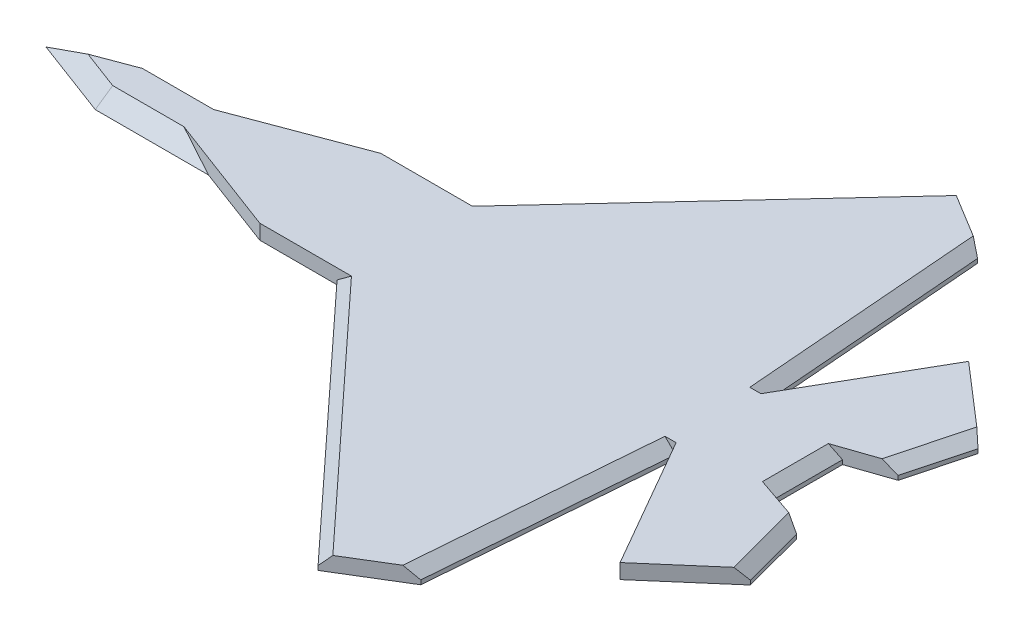
ISO-10303-21;
HEADER;
FILE_DESCRIPTION(('STEP AP214'),'2;1');
FILE_NAME('part.step','',(''),(''),'','','');
FILE_SCHEMA(('AUTOMOTIVE_DESIGN { 1 0 10303 214 1 1 1 1 }'));
ENDSEC;
DATA;
#1=APPLICATION_CONTEXT('core data for automotive mechanical design processes');
#2=APPLICATION_PROTOCOL_DEFINITION('international standard','automotive_design',2000,#1);
#3=PRODUCT_CONTEXT('',#1,'mechanical');
#4=PRODUCT('Part','Part','',(#3));
#5=PRODUCT_RELATED_PRODUCT_CATEGORY('part','',(#4));
#6=PRODUCT_DEFINITION_FORMATION('','',#4);
#7=PRODUCT_DEFINITION_CONTEXT('part definition',#1,'design');
#8=PRODUCT_DEFINITION('design','',#6,#7);
#9=PRODUCT_DEFINITION_SHAPE('','',#8);
#10=(LENGTH_UNIT() NAMED_UNIT(*) SI_UNIT(.MILLI.,.METRE.));
#11=(NAMED_UNIT(*) PLANE_ANGLE_UNIT() SI_UNIT($,.RADIAN.));
#12=(NAMED_UNIT(*) SI_UNIT($,.STERADIAN.) SOLID_ANGLE_UNIT());
#13=UNCERTAINTY_MEASURE_WITH_UNIT(LENGTH_MEASURE(1.E-05),#10,'distance_accuracy_value','');
#14=(GEOMETRIC_REPRESENTATION_CONTEXT(3) GLOBAL_UNCERTAINTY_ASSIGNED_CONTEXT((#13)) GLOBAL_UNIT_ASSIGNED_CONTEXT((#10,
#11,#12)) REPRESENTATION_CONTEXT('',''));
#15=CARTESIAN_POINT('',(0.,0.,0.));
#16=DIRECTION('',(0.,0.,1.));
#17=DIRECTION('',(1.,0.,0.));
#18=AXIS2_PLACEMENT_3D('',#15,#16,#17);
#19=CARTESIAN_POINT('',(11.0410396775364,0.7,1.65535448667242));
#20=DIRECTION('',(0.351548913957033,0.,-0.936169515149703));
#21=DIRECTION('',(-0.936169515149703,0.,-0.351548913957033));
#22=AXIS2_PLACEMENT_3D('',#19,#20,#21);
#23=PLANE('',#22);
#24=DIRECTION('',(0.936169515149703,0.,0.351548913957033));
#25=VECTOR('',#24,1.);
#26=CARTESIAN_POINT('',(11.0410396775364,0.,1.65535448667242));
#27=LINE('',#26,#25);
#28=CARTESIAN_POINT('',(10.2421441514952,0.,1.35535448667241));
#29=VERTEX_POINT('',#28);
#30=CARTESIAN_POINT('',(14.1370887976962,0.,2.81797801599737));
#31=VERTEX_POINT('',#30);
#32=EDGE_CURVE('E267',#29,#31,#27,.T.);
#33=ORIENTED_EDGE('',*,*,#32,.T.);
#34=DIRECTION('',(0.,-1.,0.));
#35=VECTOR('',#34,1.);
#36=CARTESIAN_POINT('',(14.1370887976962,0.7,2.81797801599737));
#37=LINE('',#36,#35);
#38=CARTESIAN_POINT('',(14.1370887976962,0.7,2.81797801599737));
#39=VERTEX_POINT('',#38);
#40=EDGE_CURVE('E266',#39,#31,#37,.T.);
#41=ORIENTED_EDGE('',*,*,#40,.F.);
#42=DIRECTION('',(0.936169515149703,0.,0.351548913957033));
#43=VECTOR('',#42,1.);
#44=CARTESIAN_POINT('',(11.0410396775364,0.7,1.65535448667242));
#45=LINE('',#44,#43);
#46=CARTESIAN_POINT('',(8.37805459073245,0.7,0.655354486672405));
#47=VERTEX_POINT('',#46);
#48=EDGE_CURVE('E250',#47,#39,#45,.T.);
#49=ORIENTED_EDGE('',*,*,#48,.F.);
#50=DIRECTION('',(-0.883184039008036,0.331651890723881,-0.331651890723884));
#51=VECTOR('',#50,1.);
#52=CARTESIAN_POINT('',(10.7481300211423,-0.190007023379282,1.5453615100517));
#53=LINE('',#52,#51);
#54=EDGE_CURVE('E422',#47,#29,#53,.F.);
#55=ORIENTED_EDGE('',*,*,#54,.T.);
#56=EDGE_LOOP('',(#33,#41,#49,#55));
#57=FACE_BOUND('',#56,.T.);
#58=ADVANCED_FACE('F42',(#57),#23,.F.);
#59=CARTESIAN_POINT('',(14.1370887976962,0.7,2.81797801599737));
#60=DIRECTION('',(0.,0.,-1.));
#61=DIRECTION('',(-1.,0.,0.));
#62=AXIS2_PLACEMENT_3D('',#59,#60,#61);
#63=PLANE('',#62);
#64=DIRECTION('',(1.,0.,0.));
#65=VECTOR('',#64,1.);
#66=CARTESIAN_POINT('',(14.1370887976962,0.,2.81797801599737));
#67=LINE('',#66,#65);
#68=CARTESIAN_POINT('',(17.7986590133896,0.,2.81797801599737));
#69=VERTEX_POINT('',#68);
#70=EDGE_CURVE('E309',#31,#69,#67,.T.);
#71=ORIENTED_EDGE('',*,*,#70,.T.);
#72=DIRECTION('',(0.,-1.,0.));
#73=VECTOR('',#72,1.);
#74=CARTESIAN_POINT('',(17.7986590133896,0.7,2.81797801599737));
#75=LINE('',#74,#73);
#76=CARTESIAN_POINT('',(17.7986590133896,0.199999999999999,2.81797801599737));
#77=VERTEX_POINT('',#76);
#78=EDGE_CURVE('E272',#77,#69,#75,.T.);
#79=ORIENTED_EDGE('',*,*,#78,.F.);
#80=DIRECTION('',(-0.806261036985968,-0.591559921088567,0.));
#81=VECTOR('',#80,1.);
#82=CARTESIAN_POINT('',(15.6569060348871,-1.37142062537271,2.81797801599737));
#83=LINE('',#82,#81);
#84=CARTESIAN_POINT('',(18.4801293160956,0.7,2.81797801599737));
#85=VERTEX_POINT('',#84);
#86=EDGE_CURVE('E51',#77,#85,#83,.F.);
#87=ORIENTED_EDGE('',*,*,#86,.T.);
#88=DIRECTION('',(1.,0.,0.));
#89=VECTOR('',#88,1.);
#90=CARTESIAN_POINT('',(14.1370887976962,0.7,2.81797801599737));
#91=LINE('',#90,#89);
#92=EDGE_CURVE('E256',#39,#85,#91,.T.);
#93=ORIENTED_EDGE('',*,*,#92,.F.);
#94=ORIENTED_EDGE('',*,*,#40,.T.);
#95=EDGE_LOOP('',(#71,#79,#87,#93,#94));
#96=FACE_BOUND('',#95,.T.);
#97=ADVANCED_FACE('F274',(#96),#63,.F.);
#98=CARTESIAN_POINT('',(17.7986590133896,0.7,2.81797801599737));
#99=DIRECTION('',(0.733707687649136,0.,-0.679465252301071));
#100=DIRECTION('',(-0.679465252301071,0.,-0.733707687649136));
#101=AXIS2_PLACEMENT_3D('',#98,#99,#100);
#102=PLANE('',#101);
#103=DIRECTION('',(0.,-1.,0.));
#104=VECTOR('',#103,1.);
#105=CARTESIAN_POINT('',(29.0707661861376,0.7,14.9899495195314));
#106=LINE('',#105,#104);
#107=CARTESIAN_POINT('',(29.0707661861376,0.199999999999999,14.9899495195314));
#108=VERTEX_POINT('',#107);
#109=CARTESIAN_POINT('',(29.0707661861376,0.,14.9899495195314));
#110=VERTEX_POINT('',#109);
#111=EDGE_CURVE('E400',#108,#110,#106,.T.);
#112=ORIENTED_EDGE('',*,*,#111,.F.);
#113=DIRECTION('',(-0.679465252301071,0.,-0.733707687649136));
#114=VECTOR('',#113,1.);
#115=CARTESIAN_POINT('',(17.7986590133896,0.199999999999999,2.81797801599737));
#116=LINE('',#115,#114);
#117=EDGE_CURVE('E64',#108,#77,#116,.T.);
#118=ORIENTED_EDGE('',*,*,#117,.T.);
#119=ORIENTED_EDGE('',*,*,#78,.T.);
#120=DIRECTION('',(0.679465252301071,0.,0.733707687649136));
#121=VECTOR('',#120,1.);
#122=CARTESIAN_POINT('',(17.7986590133896,0.,2.81797801599737));
#123=LINE('',#122,#121);
#124=EDGE_CURVE('E312',#69,#110,#123,.T.);
#125=ORIENTED_EDGE('',*,*,#124,.T.);
#126=EDGE_LOOP('',(#112,#118,#119,#125));
#127=FACE_BOUND('',#126,.T.);
#128=ADVANCED_FACE('F631',(#127),#102,.F.);
#129=CARTESIAN_POINT('',(29.0707661861376,0.7,14.9899495195314));
#130=DIRECTION('',(-0.520566767919859,0.,-0.853820964920323));
#131=DIRECTION('',(-0.853820964920323,0.,0.520566767919859));
#132=AXIS2_PLACEMENT_3D('',#129,#130,#131);
#133=PLANE('',#132);
#134=DIRECTION('',(0.853820964920323,0.,-0.520566767919859));
#135=VECTOR('',#134,1.);
#136=CARTESIAN_POINT('',(29.0707661861376,0.7,14.9899495195314));
#137=LINE('',#136,#135);
#138=CARTESIAN_POINT('',(29.5063171121257,0.7,14.7243981368392));
#139=VERTEX_POINT('',#138);
#140=CARTESIAN_POINT('',(31.5669709440536,0.7,13.4680364999608));
#141=VERTEX_POINT('',#140);
#142=EDGE_CURVE('E277',#139,#141,#137,.T.);
#143=ORIENTED_EDGE('',*,*,#142,.F.);
#144=DIRECTION('',(0.609760501852625,0.699987608187588,-0.371765354443169));
#145=VECTOR('',#144,1.);
#146=CARTESIAN_POINT('',(26.8435518005458,-2.35677838422562,16.3478615898684));
#147=LINE('',#146,#145);
#148=EDGE_CURVE('E474',#139,#108,#147,.F.);
#149=ORIENTED_EDGE('',*,*,#148,.T.);
#150=ORIENTED_EDGE('',*,*,#111,.T.);
#151=DIRECTION('',(0.853820964920323,0.,-0.520566767919859));
#152=VECTOR('',#151,1.);
#153=CARTESIAN_POINT('',(29.0707661861376,0.,14.9899495195314));
#154=LINE('',#153,#152);
#155=CARTESIAN_POINT('',(32.0942080010503,0.,13.1465849287711));
#156=VERTEX_POINT('',#155);
#157=EDGE_CURVE('E315',#110,#156,#154,.T.);
#158=ORIENTED_EDGE('',*,*,#157,.T.);
#159=DIRECTION('',(0.,-1.,0.));
#160=VECTOR('',#159,1.);
#161=CARTESIAN_POINT('',(32.0942080010503,0.7,13.1465849287711));
#162=LINE('',#161,#160);
#163=CARTESIAN_POINT('',(32.0942080010503,0.199999999999999,13.1465849287711));
#164=VERTEX_POINT('',#163);
#165=EDGE_CURVE('E398',#164,#156,#162,.T.);
#166=ORIENTED_EDGE('',*,*,#165,.F.);
#167=DIRECTION('',(0.663566700068654,-0.62928685613312,-0.404570497266041));
#168=VECTOR('',#167,1.);
#169=CARTESIAN_POINT('',(34.8700813751098,-2.43247180487636,11.4541605331909));
#170=LINE('',#169,#168);
#171=EDGE_CURVE('E472',#164,#141,#170,.F.);
#172=ORIENTED_EDGE('',*,*,#171,.T.);
#173=EDGE_LOOP('',(#143,#149,#150,#158,#166,#172));
#174=FACE_BOUND('',#173,.T.);
#175=ADVANCED_FACE('F551',(#174),#133,.F.);
#176=CARTESIAN_POINT('',(32.0942080010503,0.7,13.1465849287711));
#177=DIRECTION('',(-0.996832039263626,0.,-0.0795354354833161));
#178=DIRECTION('',(-0.0795354354833161,0.,0.996832039263626));
#179=AXIS2_PLACEMENT_3D('',#176,#177,#178);
#180=PLANE('',#179);
#181=DIRECTION('',(0.,-1.,0.));
#182=VECTOR('',#181,1.);
#183=CARTESIAN_POINT('',(32.9866731254356,0.7,1.96115764712529));
#184=LINE('',#183,#182);
#185=CARTESIAN_POINT('',(32.9866731254356,0.199999999999999,1.96115764712529));
#186=VERTEX_POINT('',#185);
#187=CARTESIAN_POINT('',(32.9866731254356,0.,1.96115764712529));
#188=VERTEX_POINT('',#187);
#189=EDGE_CURVE('E396',#186,#188,#184,.T.);
#190=ORIENTED_EDGE('',*,*,#189,.F.);
#191=DIRECTION('',(-0.0795354354833161,0.,0.996832039263626));
#192=VECTOR('',#191,1.);
#193=CARTESIAN_POINT('',(32.0942080010503,0.199999999999999,13.1465849287711));
#194=LINE('',#193,#192);
#195=EDGE_CURVE('E477',#186,#164,#194,.T.);
#196=ORIENTED_EDGE('',*,*,#195,.T.);
#197=ORIENTED_EDGE('',*,*,#165,.T.);
#198=DIRECTION('',(0.0795354354833161,0.,-0.996832039263626));
#199=VECTOR('',#198,1.);
#200=CARTESIAN_POINT('',(32.0942080010503,0.,13.1465849287711));
#201=LINE('',#200,#199);
#202=EDGE_CURVE('E318',#156,#188,#201,.T.);
#203=ORIENTED_EDGE('',*,*,#202,.T.);
#204=EDGE_LOOP('',(#190,#196,#197,#203));
#205=FACE_BOUND('',#204,.T.);
#206=ADVANCED_FACE('F834',(#205),#180,.F.);
#207=CARTESIAN_POINT('',(32.9866731254356,0.7,1.96115764712529));
#208=DIRECTION('',(0.,0.,-1.));
#209=DIRECTION('',(-1.,0.,0.));
#210=AXIS2_PLACEMENT_3D('',#207,#208,#209);
#211=PLANE('',#210);
#212=DIRECTION('',(1.,0.,0.));
#213=VECTOR('',#212,1.);
#214=CARTESIAN_POINT('',(32.9866731254356,0.,1.96115764712529));
#215=LINE('',#214,#213);
#216=CARTESIAN_POINT('',(33.011493829214,0.,1.96115764712529));
#217=VERTEX_POINT('',#216);
#218=EDGE_CURVE('E321',#188,#217,#215,.T.);
#219=ORIENTED_EDGE('',*,*,#218,.T.);
#220=DIRECTION('',(0.,-1.,0.));
#221=VECTOR('',#220,1.);
#222=CARTESIAN_POINT('',(33.011493829214,0.7,1.96115764712529));
#223=LINE('',#222,#221);
#224=CARTESIAN_POINT('',(33.011493829214,0.7,1.96115764712529));
#225=VERTEX_POINT('',#224);
#226=EDGE_CURVE('E393',#225,#217,#223,.T.);
#227=ORIENTED_EDGE('',*,*,#226,.F.);
#228=DIRECTION('',(1.,0.,0.));
#229=VECTOR('',#228,1.);
#230=CARTESIAN_POINT('',(32.9866731254356,0.7,1.96115764712529));
#231=LINE('',#230,#229);
#232=CARTESIAN_POINT('',(32.4850841111325,0.7,1.96115764712529));
#233=VERTEX_POINT('',#232);
#234=EDGE_CURVE('E280',#233,#225,#231,.T.);
#235=ORIENTED_EDGE('',*,*,#234,.F.);
#236=DIRECTION('',(-0.708227710097085,0.70598407251909,0.));
#237=VECTOR('',#236,1.);
#238=CARTESIAN_POINT('',(32.736674383913,0.44920675532532,1.96115764712529));
#239=LINE('',#238,#237);
#240=EDGE_CURVE('E11',#233,#186,#239,.F.);
#241=ORIENTED_EDGE('',*,*,#240,.T.);
#242=ORIENTED_EDGE('',*,*,#189,.T.);
#243=EDGE_LOOP('',(#219,#227,#235,#241,#242));
#244=FACE_BOUND('',#243,.T.);
#245=ADVANCED_FACE('F559',(#244),#211,.F.);
#246=CARTESIAN_POINT('',(33.011493829214,0.7,1.96115764712529));
#247=DIRECTION('',(0.866853810966156,0.,-0.498562403730417));
#248=DIRECTION('',(-0.498562403730417,0.,-0.866853810966156));
#249=AXIS2_PLACEMENT_3D('',#246,#247,#248);
#250=PLANE('',#249);
#251=DIRECTION('',(0.498562403730417,0.,0.866853810966157));
#252=VECTOR('',#251,1.);
#253=CARTESIAN_POINT('',(33.011493829214,0.,1.96115764712529));
#254=LINE('',#253,#252);
#255=CARTESIAN_POINT('',(36.6051406744816,0.,8.20945563305031));
#256=VERTEX_POINT('',#255);
#257=EDGE_CURVE('E323',#217,#256,#254,.T.);
#258=ORIENTED_EDGE('',*,*,#257,.T.);
#259=DIRECTION('',(0.,-1.,0.));
#260=VECTOR('',#259,1.);
#261=CARTESIAN_POINT('',(36.6051406744816,0.7,8.20945563305031));
#262=LINE('',#261,#260);
#263=CARTESIAN_POINT('',(36.6051406744816,0.7,8.20945563305031));
#264=VERTEX_POINT('',#263);
#265=EDGE_CURVE('E390',#264,#256,#262,.T.);
#266=ORIENTED_EDGE('',*,*,#265,.F.);
#267=DIRECTION('',(0.498562403730417,0.,0.866853810966157));
#268=VECTOR('',#267,1.);
#269=CARTESIAN_POINT('',(33.011493829214,0.7,1.96115764712529));
#270=LINE('',#269,#268);
#271=EDGE_CURVE('E284',#225,#264,#270,.T.);
#272=ORIENTED_EDGE('',*,*,#271,.F.);
#273=ORIENTED_EDGE('',*,*,#226,.T.);
#274=EDGE_LOOP('',(#258,#266,#272,#273));
#275=FACE_BOUND('',#274,.T.);
#276=ADVANCED_FACE('F563',(#275),#250,.F.);
#277=CARTESIAN_POINT('',(36.6051406744816,0.7,8.20945563305031));
#278=DIRECTION('',(-0.654307622119322,0.,-0.75622849432996));
#279=DIRECTION('',(-0.75622849432996,0.,0.654307622119322));
#280=AXIS2_PLACEMENT_3D('',#277,#278,#279);
#281=PLANE('',#280);
#282=DIRECTION('',(0.,-1.,0.));
#283=VECTOR('',#282,1.);
#284=CARTESIAN_POINT('',(39.9164502704821,0.7,5.34442856239009));
#285=LINE('',#284,#283);
#286=CARTESIAN_POINT('',(39.9164502704821,0.2,5.34442856239009));
#287=VERTEX_POINT('',#286);
#288=CARTESIAN_POINT('',(39.9164502704821,0.,5.34442856239009));
#289=VERTEX_POINT('',#288);
#290=EDGE_CURVE('E388',#287,#289,#285,.T.);
#291=ORIENTED_EDGE('',*,*,#290,.F.);
#292=DIRECTION('',(0.562224307068311,-0.668782357841126,-0.486450394574845));
#293=VECTOR('',#292,1.);
#294=CARTESIAN_POINT('',(42.3653303273192,-2.71301489083901,3.22559688802398));
#295=LINE('',#294,#293);
#296=CARTESIAN_POINT('',(39.4961159864833,0.7,5.70811219494369));
#297=VERTEX_POINT('',#296);
#298=EDGE_CURVE('E456',#287,#297,#295,.F.);
#299=ORIENTED_EDGE('',*,*,#298,.T.);
#300=DIRECTION('',(0.75622849432996,0.,-0.654307622119322));
#301=VECTOR('',#300,1.);
#302=CARTESIAN_POINT('',(36.6051406744816,0.7,8.20945563305031));
#303=LINE('',#302,#301);
#304=EDGE_CURVE('E286',#264,#297,#303,.T.);
#305=ORIENTED_EDGE('',*,*,#304,.F.);
#306=ORIENTED_EDGE('',*,*,#265,.T.);
#307=DIRECTION('',(0.75622849432996,0.,-0.654307622119322));
#308=VECTOR('',#307,1.);
#309=CARTESIAN_POINT('',(36.6051406744816,0.,8.20945563305031));
#310=LINE('',#309,#308);
#311=EDGE_CURVE('E325',#256,#289,#310,.T.);
#312=ORIENTED_EDGE('',*,*,#311,.T.);
#313=EDGE_LOOP('',(#291,#299,#305,#306,#312));
#314=FACE_BOUND('',#313,.T.);
#315=ADVANCED_FACE('F568',(#314),#281,.F.);
#316=CARTESIAN_POINT('',(39.9164502704821,0.7,5.34442856239009));
#317=DIRECTION('',(-0.966074987931891,0.,0.258261723242909));
#318=DIRECTION('',(0.258261723242909,0.,0.966074987931891));
#319=AXIS2_PLACEMENT_3D('',#316,#317,#318);
#320=PLANE('',#319);
#321=DIRECTION('',(0.,-1.,0.));
#322=VECTOR('',#321,1.);
#323=CARTESIAN_POINT('',(39.1176402500264,0.7,2.35633427113597));
#324=LINE('',#323,#322);
#325=CARTESIAN_POINT('',(39.1176402500264,0.2,2.35633427113597));
#326=VERTEX_POINT('',#325);
#327=CARTESIAN_POINT('',(39.1176402500264,0.,2.35633427113597));
#328=VERTEX_POINT('',#327);
#329=EDGE_CURVE('E386',#326,#328,#324,.T.);
#330=ORIENTED_EDGE('',*,*,#329,.F.);
#331=DIRECTION('',(0.258261723242909,0.,0.966074987931891));
#332=VECTOR('',#331,1.);
#333=CARTESIAN_POINT('',(39.9164502704821,0.2,5.34442856239009));
#334=LINE('',#333,#332);
#335=EDGE_CURVE('E454',#326,#287,#334,.T.);
#336=ORIENTED_EDGE('',*,*,#335,.T.);
#337=ORIENTED_EDGE('',*,*,#290,.T.);
#338=DIRECTION('',(-0.258261723242909,0.,-0.966074987931891));
#339=VECTOR('',#338,1.);
#340=CARTESIAN_POINT('',(39.9164502704821,0.,5.34442856239009));
#341=LINE('',#340,#339);
#342=EDGE_CURVE('E328',#289,#328,#341,.T.);
#343=ORIENTED_EDGE('',*,*,#342,.T.);
#344=EDGE_LOOP('',(#330,#336,#337,#343));
#345=FACE_BOUND('',#344,.T.);
#346=ADVANCED_FACE('F579',(#345),#320,.F.);
#347=CARTESIAN_POINT('',(39.1176402500264,0.7,2.35633427113597));
#348=DIRECTION('',(-0.324142953889491,0.,0.946008110664912));
#349=DIRECTION('',(0.946008110664912,0.,0.324142953889491));
#350=AXIS2_PLACEMENT_3D('',#347,#348,#349);
#351=PLANE('',#350);
#352=DIRECTION('',(-0.946008110664912,0.,-0.324142953889491));
#353=VECTOR('',#352,1.);
#354=CARTESIAN_POINT('',(39.1176402500264,0.7,2.35633427113597));
#355=LINE('',#354,#353);
#356=CARTESIAN_POINT('',(38.547893859349,0.7,2.16111472073249));
#357=VERTEX_POINT('',#356);
#358=CARTESIAN_POINT('',(36.6558593795197,0.7,1.51282255680846));
#359=VERTEX_POINT('',#358);
#360=EDGE_CURVE('E289',#357,#359,#355,.T.);
#361=ORIENTED_EDGE('',*,*,#360,.F.);
#362=DIRECTION('',(-0.727863563472156,0.638761013129685,-0.249397275596896));
#363=VECTOR('',#362,1.);
#364=CARTESIAN_POINT('',(34.7880873914164,3.99954391063574,0.872843763190797));
#365=LINE('',#364,#363);
#366=EDGE_CURVE('E452',#357,#326,#365,.F.);
#367=ORIENTED_EDGE('',*,*,#366,.T.);
#368=ORIENTED_EDGE('',*,*,#329,.T.);
#369=DIRECTION('',(-0.946008110664912,0.,-0.324142953889491));
#370=VECTOR('',#369,1.);
#371=CARTESIAN_POINT('',(39.1176402500264,0.,2.35633427113597));
#372=LINE('',#371,#370);
#373=CARTESIAN_POINT('',(37.1558593795197,0.,1.68414400227771));
#374=VERTEX_POINT('',#373);
#375=EDGE_CURVE('E331',#328,#374,#372,.T.);
#376=ORIENTED_EDGE('',*,*,#375,.T.);
#377=DIRECTION('',(0.,-1.,0.));
#378=VECTOR('',#377,1.);
#379=CARTESIAN_POINT('',(37.1558593795197,0.7,1.68414400227771));
#380=LINE('',#379,#378);
#381=CARTESIAN_POINT('',(37.1558593795197,0.200000000000006,1.68414400227771));
#382=VERTEX_POINT('',#381);
#383=EDGE_CURVE('E384',#382,#374,#380,.T.);
#384=ORIENTED_EDGE('',*,*,#383,.F.);
#385=DIRECTION('',(0.687223686615927,-0.687223686615917,0.235472310703493));
#386=VECTOR('',#385,1.);
#387=CARTESIAN_POINT('',(37.9549992541256,-0.599139874605936,1.95796359917692));
#388=LINE('',#387,#386);
#389=EDGE_CURVE('E481',#382,#359,#388,.F.);
#390=ORIENTED_EDGE('',*,*,#389,.T.);
#391=EDGE_LOOP('',(#361,#367,#368,#376,#384,#390));
#392=FACE_BOUND('',#391,.T.);
#393=ADVANCED_FACE('F577',(#392),#351,.F.);
#394=CARTESIAN_POINT('',(37.1558593795197,0.7,-1.78164049469839));
#395=DIRECTION('',(-1.,0.,0.));
#396=DIRECTION('',(0.,0.,1.));
#397=AXIS2_PLACEMENT_3D('',#394,#395,#396);
#398=PLANE('',#397);
#399=DIRECTION('',(0.,-1.,0.));
#400=VECTOR('',#399,1.);
#401=CARTESIAN_POINT('',(37.1558593795197,0.7,-1.78164049469839));
#402=LINE('',#401,#400);
#403=CARTESIAN_POINT('',(37.1558593795197,0.200000000000006,-1.78164049469839));
#404=VERTEX_POINT('',#403);
#405=CARTESIAN_POINT('',(37.1558593795197,0.,-1.78164049469839));
#406=VERTEX_POINT('',#405);
#407=EDGE_CURVE('E382',#404,#406,#402,.T.);
#408=ORIENTED_EDGE('',*,*,#407,.F.);
#409=DIRECTION('',(0.,0.,1.));
#410=VECTOR('',#409,1.);
#411=CARTESIAN_POINT('',(37.1558593795197,0.200000000000006,-1.78164049469839));
#412=LINE('',#411,#410);
#413=EDGE_CURVE('E450',#404,#382,#412,.T.);
#414=ORIENTED_EDGE('',*,*,#413,.T.);
#415=ORIENTED_EDGE('',*,*,#383,.T.);
#416=DIRECTION('',(0.,0.,-1.));
#417=VECTOR('',#416,1.);
#418=CARTESIAN_POINT('',(37.1558593795197,0.,-1.78164049469839));
#419=LINE('',#418,#417);
#420=EDGE_CURVE('E334',#374,#406,#419,.T.);
#421=ORIENTED_EDGE('',*,*,#420,.T.);
#422=EDGE_LOOP('',(#408,#414,#415,#421));
#423=FACE_BOUND('',#422,.T.);
#424=ADVANCED_FACE('F788',(#423),#398,.F.);
#425=CARTESIAN_POINT('',(39.1176402500264,0.7,-2.45383076355665));
#426=DIRECTION('',(-0.324142953889491,0.,-0.946008110664912));
#427=DIRECTION('',(-0.946008110664912,0.,0.324142953889491));
#428=AXIS2_PLACEMENT_3D('',#425,#426,#427);
#429=PLANE('',#428);
#430=DIRECTION('',(0.,-1.,0.));
#431=VECTOR('',#430,1.);
#432=CARTESIAN_POINT('',(39.1176402500264,0.7,-2.45383076355665));
#433=LINE('',#432,#431);
#434=CARTESIAN_POINT('',(39.1176402500264,0.199999999999999,-2.45383076355665));
#435=VERTEX_POINT('',#434);
#436=CARTESIAN_POINT('',(39.1176402500264,0.,-2.45383076355665));
#437=VERTEX_POINT('',#436);
#438=EDGE_CURVE('E380',#435,#437,#433,.T.);
#439=ORIENTED_EDGE('',*,*,#438,.F.);
#440=DIRECTION('',(0.727863563472155,-0.638761013129686,-0.249397275596895));
#441=VECTOR('',#440,1.);
#442=CARTESIAN_POINT('',(34.7586823482283,4.02534928972131,-0.960264826605333));
#443=LINE('',#442,#441);
#444=CARTESIAN_POINT('',(38.547893859349,0.7,-2.25861121315318));
#445=VERTEX_POINT('',#444);
#446=EDGE_CURVE('E462',#435,#445,#443,.F.);
#447=ORIENTED_EDGE('',*,*,#446,.T.);
#448=DIRECTION('',(0.946008110664912,0.,-0.324142953889491));
#449=VECTOR('',#448,1.);
#450=CARTESIAN_POINT('',(39.1176402500264,0.7,-2.45383076355665));
#451=LINE('',#450,#449);
#452=CARTESIAN_POINT('',(36.6558593795197,0.7,-1.61031904922914));
#453=VERTEX_POINT('',#452);
#454=EDGE_CURVE('E291',#453,#445,#451,.T.);
#455=ORIENTED_EDGE('',*,*,#454,.F.);
#456=DIRECTION('',(-0.687223686615927,0.687223686615917,0.235472310703493));
#457=VECTOR('',#456,1.);
#458=CARTESIAN_POINT('',(37.9549992541256,-0.599139874605936,-2.0554600915976));
#459=LINE('',#458,#457);
#460=EDGE_CURVE('E479',#453,#404,#459,.F.);
#461=ORIENTED_EDGE('',*,*,#460,.T.);
#462=ORIENTED_EDGE('',*,*,#407,.T.);
#463=DIRECTION('',(0.946008110664912,0.,-0.324142953889491));
#464=VECTOR('',#463,1.);
#465=CARTESIAN_POINT('',(39.1176402500264,0.,-2.45383076355665));
#466=LINE('',#465,#464);
#467=EDGE_CURVE('E337',#406,#437,#466,.T.);
#468=ORIENTED_EDGE('',*,*,#467,.T.);
#469=EDGE_LOOP('',(#439,#447,#455,#461,#462,#468));
#470=FACE_BOUND('',#469,.T.);
#471=ADVANCED_FACE('F779',(#470),#429,.F.);
#472=CARTESIAN_POINT('',(39.9164502704821,0.7,-5.44192505481078));
#473=DIRECTION('',(-0.966074987931891,0.,-0.258261723242909));
#474=DIRECTION('',(-0.258261723242909,0.,0.966074987931891));
#475=AXIS2_PLACEMENT_3D('',#472,#473,#474);
#476=PLANE('',#475);
#477=DIRECTION('',(0.,-1.,0.));
#478=VECTOR('',#477,1.);
#479=CARTESIAN_POINT('',(39.9164502704821,0.7,-5.44192505481078));
#480=LINE('',#479,#478);
#481=CARTESIAN_POINT('',(39.9164502704821,0.199999999999999,-5.44192505481078));
#482=VERTEX_POINT('',#481);
#483=CARTESIAN_POINT('',(39.9164502704821,0.,-5.44192505481078));
#484=VERTEX_POINT('',#483);
#485=EDGE_CURVE('E378',#482,#484,#480,.T.);
#486=ORIENTED_EDGE('',*,*,#485,.F.);
#487=DIRECTION('',(-0.258261723242909,0.,0.966074987931891));
#488=VECTOR('',#487,1.);
#489=CARTESIAN_POINT('',(39.9164502704821,0.199999999999999,-5.44192505481078));
#490=LINE('',#489,#488);
#491=EDGE_CURVE('E460',#482,#435,#490,.T.);
#492=ORIENTED_EDGE('',*,*,#491,.T.);
#493=ORIENTED_EDGE('',*,*,#438,.T.);
#494=DIRECTION('',(0.258261723242909,0.,-0.966074987931891));
#495=VECTOR('',#494,1.);
#496=CARTESIAN_POINT('',(39.9164502704821,0.,-5.44192505481078));
#497=LINE('',#496,#495);
#498=EDGE_CURVE('E340',#437,#484,#497,.T.);
#499=ORIENTED_EDGE('',*,*,#498,.T.);
#500=EDGE_LOOP('',(#486,#492,#493,#499));
#501=FACE_BOUND('',#500,.T.);
#502=ADVANCED_FACE('F604',(#501),#476,.F.);
#503=CARTESIAN_POINT('',(36.6051406744816,0.7,-8.306952125471));
#504=DIRECTION('',(-0.654307622119322,0.,0.75622849432996));
#505=DIRECTION('',(0.75622849432996,0.,0.654307622119322));
#506=AXIS2_PLACEMENT_3D('',#503,#504,#505);
#507=PLANE('',#506);
#508=DIRECTION('',(-0.75622849432996,0.,-0.654307622119322));
#509=VECTOR('',#508,1.);
#510=CARTESIAN_POINT('',(36.6051406744816,0.7,-8.306952125471));
#511=LINE('',#510,#509);
#512=CARTESIAN_POINT('',(39.4961159864833,0.7,-5.80560868736438));
#513=VERTEX_POINT('',#512);
#514=CARTESIAN_POINT('',(36.6051406744816,0.7,-8.306952125471));
#515=VERTEX_POINT('',#514);
#516=EDGE_CURVE('E294',#513,#515,#511,.T.);
#517=ORIENTED_EDGE('',*,*,#516,.F.);
#518=DIRECTION('',(-0.56222430706831,0.668782357841127,-0.486450394574844));
#519=VECTOR('',#518,1.);
#520=CARTESIAN_POINT('',(42.3825273783958,-2.73347128915249,-3.30821406594945));
#521=LINE('',#520,#519);
#522=EDGE_CURVE('E458',#513,#482,#521,.F.);
#523=ORIENTED_EDGE('',*,*,#522,.T.);
#524=ORIENTED_EDGE('',*,*,#485,.T.);
#525=DIRECTION('',(-0.75622849432996,0.,-0.654307622119322));
#526=VECTOR('',#525,1.);
#527=CARTESIAN_POINT('',(36.6051406744816,0.,-8.306952125471));
#528=LINE('',#527,#526);
#529=CARTESIAN_POINT('',(36.6051406744816,0.,-8.306952125471));
#530=VERTEX_POINT('',#529);
#531=EDGE_CURVE('E343',#484,#530,#528,.T.);
#532=ORIENTED_EDGE('',*,*,#531,.T.);
#533=DIRECTION('',(0.,-1.,0.));
#534=VECTOR('',#533,1.);
#535=CARTESIAN_POINT('',(36.6051406744816,0.7,-8.306952125471));
#536=LINE('',#535,#534);
#537=EDGE_CURVE('E375',#515,#530,#536,.T.);
#538=ORIENTED_EDGE('',*,*,#537,.F.);
#539=EDGE_LOOP('',(#517,#523,#524,#532,#538));
#540=FACE_BOUND('',#539,.T.);
#541=ADVANCED_FACE('F601',(#540),#507,.F.);
#542=CARTESIAN_POINT('',(33.011493829214,0.7,-2.05865413954598));
#543=DIRECTION('',(0.866853810966156,0.,0.498562403730417));
#544=DIRECTION('',(0.498562403730417,0.,-0.866853810966156));
#545=AXIS2_PLACEMENT_3D('',#542,#543,#544);
#546=PLANE('',#545);
#547=DIRECTION('',(-0.498562403730417,0.,0.866853810966157));
#548=VECTOR('',#547,1.);
#549=CARTESIAN_POINT('',(33.011493829214,0.,-2.05865413954598));
#550=LINE('',#549,#548);
#551=CARTESIAN_POINT('',(33.011493829214,0.,-2.05865413954598));
#552=VERTEX_POINT('',#551);
#553=EDGE_CURVE('E345',#530,#552,#550,.T.);
#554=ORIENTED_EDGE('',*,*,#553,.T.);
#555=DIRECTION('',(0.,-1.,0.));
#556=VECTOR('',#555,1.);
#557=CARTESIAN_POINT('',(33.011493829214,0.7,-2.05865413954598));
#558=LINE('',#557,#556);
#559=CARTESIAN_POINT('',(33.011493829214,0.7,-2.05865413954598));
#560=VERTEX_POINT('',#559);
#561=EDGE_CURVE('E372',#560,#552,#558,.T.);
#562=ORIENTED_EDGE('',*,*,#561,.F.);
#563=DIRECTION('',(-0.498562403730417,0.,0.866853810966157));
#564=VECTOR('',#563,1.);
#565=CARTESIAN_POINT('',(33.011493829214,0.7,-2.05865413954598));
#566=LINE('',#565,#564);
#567=EDGE_CURVE('E296',#515,#560,#566,.T.);
#568=ORIENTED_EDGE('',*,*,#567,.F.);
#569=ORIENTED_EDGE('',*,*,#537,.T.);
#570=EDGE_LOOP('',(#554,#562,#568,#569));
#571=FACE_BOUND('',#570,.T.);
#572=ADVANCED_FACE('F611',(#571),#546,.F.);
#573=CARTESIAN_POINT('',(32.9866731254356,0.7,-2.05865413954598));
#574=DIRECTION('',(0.,0.,1.));
#575=DIRECTION('',(1.,0.,0.));
#576=AXIS2_PLACEMENT_3D('',#573,#574,#575);
#577=PLANE('',#576);
#578=DIRECTION('',(-1.,0.,0.));
#579=VECTOR('',#578,1.);
#580=CARTESIAN_POINT('',(32.9866731254356,0.,-2.05865413954598));
#581=LINE('',#580,#579);
#582=CARTESIAN_POINT('',(32.9866731254356,0.,-2.05865413954598));
#583=VERTEX_POINT('',#582);
#584=EDGE_CURVE('E347',#552,#583,#581,.T.);
#585=ORIENTED_EDGE('',*,*,#584,.T.);
#586=DIRECTION('',(0.,-1.,0.));
#587=VECTOR('',#586,1.);
#588=CARTESIAN_POINT('',(32.9866731254356,0.7,-2.05865413954598));
#589=LINE('',#588,#587);
#590=CARTESIAN_POINT('',(32.9866731254356,0.2,-2.05865413954598));
#591=VERTEX_POINT('',#590);
#592=EDGE_CURVE('E370',#591,#583,#589,.T.);
#593=ORIENTED_EDGE('',*,*,#592,.F.);
#594=DIRECTION('',(0.708227710097082,-0.705984072519092,0.));
#595=VECTOR('',#594,1.);
#596=CARTESIAN_POINT('',(32.736674383913,0.449206755325321,-2.05865413954598));
#597=LINE('',#596,#595);
#598=CARTESIAN_POINT('',(32.4850841111325,0.7,-2.05865413954598));
#599=VERTEX_POINT('',#598);
#600=EDGE_CURVE('E484',#591,#599,#597,.F.);
#601=ORIENTED_EDGE('',*,*,#600,.T.);
#602=DIRECTION('',(-1.,0.,0.));
#603=VECTOR('',#602,1.);
#604=CARTESIAN_POINT('',(32.9866731254356,0.7,-2.05865413954598));
#605=LINE('',#604,#603);
#606=EDGE_CURVE('E298',#560,#599,#605,.T.);
#607=ORIENTED_EDGE('',*,*,#606,.F.);
#608=ORIENTED_EDGE('',*,*,#561,.T.);
#609=EDGE_LOOP('',(#585,#593,#601,#607,#608));
#610=FACE_BOUND('',#609,.T.);
#611=ADVANCED_FACE('F614',(#610),#577,.F.);
#612=CARTESIAN_POINT('',(32.0942080010503,0.7,-13.2440814211918));
#613=DIRECTION('',(-0.996832039263626,0.,0.0795354354833161));
#614=DIRECTION('',(0.0795354354833161,0.,0.996832039263626));
#615=AXIS2_PLACEMENT_3D('',#612,#613,#614);
#616=PLANE('',#615);
#617=DIRECTION('',(0.,-1.,0.));
#618=VECTOR('',#617,1.);
#619=CARTESIAN_POINT('',(32.0942080010503,0.7,-13.2440814211918));
#620=LINE('',#619,#618);
#621=CARTESIAN_POINT('',(32.0942080010503,0.2,-13.2440814211918));
#622=VERTEX_POINT('',#621);
#623=CARTESIAN_POINT('',(32.0942080010503,0.,-13.2440814211918));
#624=VERTEX_POINT('',#623);
#625=EDGE_CURVE('E368',#622,#624,#620,.T.);
#626=ORIENTED_EDGE('',*,*,#625,.F.);
#627=DIRECTION('',(0.0795354354833161,0.,0.996832039263626));
#628=VECTOR('',#627,1.);
#629=CARTESIAN_POINT('',(32.0942080010503,0.2,-13.2440814211918));
#630=LINE('',#629,#628);
#631=EDGE_CURVE('E468',#622,#591,#630,.T.);
#632=ORIENTED_EDGE('',*,*,#631,.T.);
#633=ORIENTED_EDGE('',*,*,#592,.T.);
#634=DIRECTION('',(-0.0795354354833161,0.,-0.996832039263626));
#635=VECTOR('',#634,1.);
#636=CARTESIAN_POINT('',(32.0942080010503,0.,-13.2440814211918));
#637=LINE('',#636,#635);
#638=EDGE_CURVE('E350',#583,#624,#637,.T.);
#639=ORIENTED_EDGE('',*,*,#638,.T.);
#640=EDGE_LOOP('',(#626,#632,#633,#639));
#641=FACE_BOUND('',#640,.T.);
#642=ADVANCED_FACE('F514',(#641),#616,.F.);
#643=CARTESIAN_POINT('',(29.0707661861376,0.7,-15.0874460119521));
#644=DIRECTION('',(-0.520566767919859,0.,0.853820964920323));
#645=DIRECTION('',(0.853820964920323,0.,0.520566767919859));
#646=AXIS2_PLACEMENT_3D('',#643,#644,#645);
#647=PLANE('',#646);
#648=DIRECTION('',(-0.853820964920323,0.,-0.520566767919859));
#649=VECTOR('',#648,1.);
#650=CARTESIAN_POINT('',(29.0707661861376,0.7,-15.0874460119521));
#651=LINE('',#650,#649);
#652=CARTESIAN_POINT('',(31.5669709440536,0.7,-13.5655329923815));
#653=VERTEX_POINT('',#652);
#654=CARTESIAN_POINT('',(29.5063171121257,0.7,-14.8218946292599));
#655=VERTEX_POINT('',#654);
#656=EDGE_CURVE('E300',#653,#655,#651,.T.);
#657=ORIENTED_EDGE('',*,*,#656,.F.);
#658=DIRECTION('',(-0.663566700068652,0.629286856133122,-0.40457049726604));
#659=VECTOR('',#658,1.);
#660=CARTESIAN_POINT('',(34.8994932808179,-2.4603642920581,-11.5337248579537));
#661=LINE('',#660,#659);
#662=EDGE_CURVE('E466',#653,#622,#661,.F.);
#663=ORIENTED_EDGE('',*,*,#662,.T.);
#664=ORIENTED_EDGE('',*,*,#625,.T.);
#665=DIRECTION('',(-0.853820964920323,0.,-0.520566767919859));
#666=VECTOR('',#665,1.);
#667=CARTESIAN_POINT('',(29.0707661861376,0.,-15.0874460119521));
#668=LINE('',#667,#666);
#669=CARTESIAN_POINT('',(29.0707661861376,0.,-15.0874460119521));
#670=VERTEX_POINT('',#669);
#671=EDGE_CURVE('E353',#624,#670,#668,.T.);
#672=ORIENTED_EDGE('',*,*,#671,.T.);
#673=DIRECTION('',(0.,-1.,0.));
#674=VECTOR('',#673,1.);
#675=CARTESIAN_POINT('',(29.0707661861376,0.7,-15.0874460119521));
#676=LINE('',#675,#674);
#677=CARTESIAN_POINT('',(29.0707661861376,0.199999999999984,-15.0874460119521));
#678=VERTEX_POINT('',#677);
#679=EDGE_CURVE('E366',#678,#670,#676,.T.);
#680=ORIENTED_EDGE('',*,*,#679,.F.);
#681=DIRECTION('',(-0.609760501852625,-0.699987608187588,-0.371765354443169));
#682=VECTOR('',#681,1.);
#683=CARTESIAN_POINT('',(26.8373778558226,-2.36386589610412,-16.4491222794474));
#684=LINE('',#683,#682);
#685=EDGE_CURVE('E464',#678,#655,#684,.F.);
#686=ORIENTED_EDGE('',*,*,#685,.T.);
#687=EDGE_LOOP('',(#657,#663,#664,#672,#680,#686));
#688=FACE_BOUND('',#687,.T.);
#689=ADVANCED_FACE('F505',(#688),#647,.F.);
#690=CARTESIAN_POINT('',(17.7986590133896,0.7,-2.91547450841806));
#691=DIRECTION('',(0.733707687649136,0.,0.679465252301071));
#692=DIRECTION('',(0.679465252301071,0.,-0.733707687649136));
#693=AXIS2_PLACEMENT_3D('',#690,#691,#692);
#694=PLANE('',#693);
#695=DIRECTION('',(0.,-1.,0.));
#696=VECTOR('',#695,1.);
#697=CARTESIAN_POINT('',(17.7986590133896,0.7,-2.91547450841806));
#698=LINE('',#697,#696);
#699=CARTESIAN_POINT('',(17.7986590133896,0.199999999999984,-2.91547450841806));
#700=VERTEX_POINT('',#699);
#701=CARTESIAN_POINT('',(17.7986590133896,0.,-2.91547450841806));
#702=VERTEX_POINT('',#701);
#703=EDGE_CURVE('E364',#700,#702,#698,.T.);
#704=ORIENTED_EDGE('',*,*,#703,.F.);
#705=DIRECTION('',(0.679465252301071,0.,-0.733707687649136));
#706=VECTOR('',#705,1.);
#707=CARTESIAN_POINT('',(17.7986590133896,0.199999999999984,-2.91547450841806));
#708=LINE('',#707,#706);
#709=EDGE_CURVE('E470',#700,#678,#708,.T.);
#710=ORIENTED_EDGE('',*,*,#709,.T.);
#711=ORIENTED_EDGE('',*,*,#679,.T.);
#712=DIRECTION('',(-0.679465252301071,0.,0.733707687649136));
#713=VECTOR('',#712,1.);
#714=CARTESIAN_POINT('',(17.7986590133896,0.,-2.91547450841806));
#715=LINE('',#714,#713);
#716=EDGE_CURVE('E356',#670,#702,#715,.T.);
#717=ORIENTED_EDGE('',*,*,#716,.T.);
#718=EDGE_LOOP('',(#704,#710,#711,#717));
#719=FACE_BOUND('',#718,.T.);
#720=ADVANCED_FACE('F497',(#719),#694,.F.);
#721=CARTESIAN_POINT('',(14.1370887976962,0.7,-2.91547450841806));
#722=DIRECTION('',(0.,0.,1.));
#723=DIRECTION('',(1.,0.,0.));
#724=AXIS2_PLACEMENT_3D('',#721,#722,#723);
#725=PLANE('',#724);
#726=DIRECTION('',(-1.,0.,0.));
#727=VECTOR('',#726,1.);
#728=CARTESIAN_POINT('',(14.1370887976962,0.,-2.91547450841806));
#729=LINE('',#728,#727);
#730=CARTESIAN_POINT('',(14.1370887976962,0.,-2.91547450841806));
#731=VERTEX_POINT('',#730);
#732=EDGE_CURVE('E359',#702,#731,#729,.T.);
#733=ORIENTED_EDGE('',*,*,#732,.T.);
#734=DIRECTION('',(0.,-1.,0.));
#735=VECTOR('',#734,1.);
#736=CARTESIAN_POINT('',(14.1370887976962,0.7,-2.91547450841806));
#737=LINE('',#736,#735);
#738=CARTESIAN_POINT('',(14.1370887976962,0.7,-2.91547450841806));
#739=VERTEX_POINT('',#738);
#740=EDGE_CURVE('E307',#739,#731,#737,.T.);
#741=ORIENTED_EDGE('',*,*,#740,.F.);
#742=DIRECTION('',(-1.,0.,0.));
#743=VECTOR('',#742,1.);
#744=CARTESIAN_POINT('',(14.1370887976962,0.7,-2.91547450841806));
#745=LINE('',#744,#743);
#746=CARTESIAN_POINT('',(18.4801293160956,0.7,-2.91547450841806));
#747=VERTEX_POINT('',#746);
#748=EDGE_CURVE('E303',#747,#739,#745,.T.);
#749=ORIENTED_EDGE('',*,*,#748,.F.);
#750=DIRECTION('',(0.806261036985968,0.591559921088567,0.));
#751=VECTOR('',#750,1.);
#752=CARTESIAN_POINT('',(15.6569060348871,-1.37142062537272,-2.91547450841806));
#753=LINE('',#752,#751);
#754=EDGE_CURVE('E487',#747,#700,#753,.F.);
#755=ORIENTED_EDGE('',*,*,#754,.T.);
#756=ORIENTED_EDGE('',*,*,#703,.T.);
#757=EDGE_LOOP('',(#733,#741,#749,#755,#756));
#758=FACE_BOUND('',#757,.T.);
#759=ADVANCED_FACE('F491',(#758),#725,.F.);
#760=CARTESIAN_POINT('',(11.0410396775364,0.7,-1.75285097909311));
#761=DIRECTION('',(0.351548913957033,0.,0.936169515149703));
#762=DIRECTION('',(0.936169515149703,0.,-0.351548913957033));
#763=AXIS2_PLACEMENT_3D('',#760,#761,#762);
#764=PLANE('',#763);
#765=DIRECTION('',(-0.936169515149703,0.,0.351548913957033));
#766=VECTOR('',#765,1.);
#767=CARTESIAN_POINT('',(11.0410396775364,0.,-1.75285097909311));
#768=LINE('',#767,#766);
#769=CARTESIAN_POINT('',(10.2421441514952,0.,-1.4528509790931));
#770=VERTEX_POINT('',#769);
#771=EDGE_CURVE('E263',#731,#770,#768,.T.);
#772=ORIENTED_EDGE('',*,*,#771,.T.);
#773=DIRECTION('',(0.883184039008036,-0.331651890723881,-0.331651890723884));
#774=VECTOR('',#773,1.);
#775=CARTESIAN_POINT('',(10.7481300211423,-0.190007023379282,-1.64285800247238));
#776=LINE('',#775,#774);
#777=CARTESIAN_POINT('',(8.37805459073245,0.7,-0.752850979093091));
#778=VERTEX_POINT('',#777);
#779=EDGE_CURVE('E419',#770,#778,#776,.F.);
#780=ORIENTED_EDGE('',*,*,#779,.T.);
#781=DIRECTION('',(-0.936169515149703,0.,0.351548913957033));
#782=VECTOR('',#781,1.);
#783=CARTESIAN_POINT('',(11.0410396775364,0.7,-1.75285097909311));
#784=LINE('',#783,#782);
#785=EDGE_CURVE('E305',#739,#778,#784,.T.);
#786=ORIENTED_EDGE('',*,*,#785,.F.);
#787=ORIENTED_EDGE('',*,*,#740,.T.);
#788=EDGE_LOOP('',(#772,#780,#786,#787));
#789=FACE_BOUND('',#788,.T.);
#790=ADVANCED_FACE('F524',(#789),#764,.F.);
#791=CARTESIAN_POINT('',(0.,0.7,0.));
#792=DIRECTION('',(0.,-1.,0.));
#793=DIRECTION('',(0.,0.,-1.));
#794=AXIS2_PLACEMENT_3D('',#791,#792,#793);
#795=PLANE('',#794);
#796=DIRECTION('',(0.,0.,-1.));
#797=VECTOR('',#796,1.);
#798=CARTESIAN_POINT('',(36.6558593795197,0.7,0.));
#799=LINE('',#798,#797);
#800=EDGE_CURVE('E448',#359,#453,#799,.T.);
#801=ORIENTED_EDGE('',*,*,#800,.T.);
#802=ORIENTED_EDGE('',*,*,#454,.T.);
#803=DIRECTION('',(0.258261723242909,0.,-0.966074987931891));
#804=VECTOR('',#803,1.);
#805=CARTESIAN_POINT('',(35.4132594205808,0.7,9.46705951179451));
#806=LINE('',#805,#804);
#807=EDGE_CURVE('E442',#445,#513,#806,.T.);
#808=ORIENTED_EDGE('',*,*,#807,.T.);
#809=ORIENTED_EDGE('',*,*,#516,.T.);
#810=ORIENTED_EDGE('',*,*,#567,.T.);
#811=ORIENTED_EDGE('',*,*,#606,.T.);
#812=DIRECTION('',(-0.0795354354833161,0.,-0.996832039263626));
#813=VECTOR('',#812,1.);
#814=CARTESIAN_POINT('',(32.4428044330946,0.7,-2.58855301319607));
#815=LINE('',#814,#813);
#816=EDGE_CURVE('E439',#599,#653,#815,.T.);
#817=ORIENTED_EDGE('',*,*,#816,.T.);
#818=ORIENTED_EDGE('',*,*,#656,.T.);
#819=DIRECTION('',(-0.679465252301071,0.,0.733707687649136));
#820=VECTOR('',#819,1.);
#821=CARTESIAN_POINT('',(8.4949037981222,0.7,7.86688220612543));
#822=LINE('',#821,#820);
#823=EDGE_CURVE('E436',#655,#747,#822,.T.);
#824=ORIENTED_EDGE('',*,*,#823,.T.);
#825=ORIENTED_EDGE('',*,*,#748,.T.);
#826=ORIENTED_EDGE('',*,*,#785,.T.);
#827=DIRECTION('',(-1.,0.,0.));
#828=VECTOR('',#827,1.);
#829=CARTESIAN_POINT('',(0.,0.7,-0.752850979093092));
#830=LINE('',#829,#828);
#831=CARTESIAN_POINT('',(5.00380830543789,0.7,-0.752850979093092));
#832=VERTEX_POINT('',#831);
#833=EDGE_CURVE('E407',#778,#832,#830,.T.);
#834=ORIENTED_EDGE('',*,*,#833,.T.);
#835=DIRECTION('',(-0.936169515149703,0.,0.351548913957033));
#836=VECTOR('',#835,1.);
#837=CARTESIAN_POINT('',(0.370633533991659,0.7,0.986991573689231));
#838=LINE('',#837,#836);
#839=CARTESIAN_POINT('',(3.12879322819323,0.7,-0.0487482462103432));
#840=VERTEX_POINT('',#839);
#841=EDGE_CURVE('E405',#832,#840,#838,.T.);
#842=ORIENTED_EDGE('',*,*,#841,.T.);
#843=DIRECTION('',(0.936169515149703,0.,0.351548913957033));
#844=VECTOR('',#843,1.);
#845=CARTESIAN_POINT('',(0.402720543806648,0.7,-1.07243880230668));
#846=LINE('',#845,#844);
#847=CARTESIAN_POINT('',(5.00380830543789,0.7,0.655354486672405));
#848=VERTEX_POINT('',#847);
#849=EDGE_CURVE('E271',#840,#848,#846,.T.);
#850=ORIENTED_EDGE('',*,*,#849,.T.);
#851=DIRECTION('',(1.,0.,0.));
#852=VECTOR('',#851,1.);
#853=CARTESIAN_POINT('',(0.,0.7,0.655354486672405));
#854=LINE('',#853,#852);
#855=EDGE_CURVE('E259',#848,#47,#854,.T.);
#856=ORIENTED_EDGE('',*,*,#855,.T.);
#857=ORIENTED_EDGE('',*,*,#48,.T.);
#858=ORIENTED_EDGE('',*,*,#92,.T.);
#859=DIRECTION('',(0.679465252301071,0.,0.733707687649136));
#860=VECTOR('',#859,1.);
#861=CARTESIAN_POINT('',(8.54350861520522,0.7,-7.9118937071064));
#862=LINE('',#861,#860);
#863=EDGE_CURVE('E434',#85,#139,#862,.T.);
#864=ORIENTED_EDGE('',*,*,#863,.T.);
#865=ORIENTED_EDGE('',*,*,#142,.T.);
#866=DIRECTION('',(0.0795354354833161,0.,-0.996832039263626));
#867=VECTOR('',#866,1.);
#868=CARTESIAN_POINT('',(32.4350745728289,0.7,2.5879362615486));
#869=LINE('',#868,#867);
#870=EDGE_CURVE('E424',#141,#233,#869,.T.);
#871=ORIENTED_EDGE('',*,*,#870,.T.);
#872=ORIENTED_EDGE('',*,*,#234,.T.);
#873=ORIENTED_EDGE('',*,*,#271,.T.);
#874=ORIENTED_EDGE('',*,*,#304,.T.);
#875=DIRECTION('',(-0.258261723242909,0.,-0.966074987931891));
#876=VECTOR('',#875,1.);
#877=CARTESIAN_POINT('',(35.4375848140776,0.7,-9.47356244181707));
#878=LINE('',#877,#876);
#879=EDGE_CURVE('E445',#297,#357,#878,.T.);
#880=ORIENTED_EDGE('',*,*,#879,.T.);
#881=ORIENTED_EDGE('',*,*,#360,.T.);
#882=EDGE_LOOP('',(#801,#802,#808,#809,#810,#811,#817,#818,#824,#825,#826,#834,#842,#850,#856,
#857,#858,#864,#865,#871,#872,#873,#874,#880,#881));
#883=FACE_BOUND('',#882,.T.);
#884=ADVANCED_FACE('F253',(#883),#795,.F.);
#885=CARTESIAN_POINT('',(0.,0.,0.));
#886=DIRECTION('',(0.,-1.,0.));
#887=DIRECTION('',(0.,0.,-1.));
#888=AXIS2_PLACEMENT_3D('',#885,#886,#887);
#889=PLANE('',#888);
#890=DIRECTION('',(-1.,0.,0.));
#891=VECTOR('',#890,1.);
#892=CARTESIAN_POINT('',(0.,0.,-1.4528509790931));
#893=LINE('',#892,#891);
#894=CARTESIAN_POINT('',(4.87670980613583,0.,-1.4528509790931));
#895=VERTEX_POINT('',#894);
#896=EDGE_CURVE('E416',#895,#770,#893,.F.);
#897=ORIENTED_EDGE('',*,*,#896,.T.);
#898=ORIENTED_EDGE('',*,*,#771,.F.);
#899=ORIENTED_EDGE('',*,*,#732,.F.);
#900=ORIENTED_EDGE('',*,*,#716,.F.);
#901=ORIENTED_EDGE('',*,*,#671,.F.);
#902=ORIENTED_EDGE('',*,*,#638,.F.);
#903=ORIENTED_EDGE('',*,*,#584,.F.);
#904=ORIENTED_EDGE('',*,*,#553,.F.);
#905=ORIENTED_EDGE('',*,*,#531,.F.);
#906=ORIENTED_EDGE('',*,*,#498,.F.);
#907=ORIENTED_EDGE('',*,*,#467,.F.);
#908=ORIENTED_EDGE('',*,*,#420,.F.);
#909=ORIENTED_EDGE('',*,*,#375,.F.);
#910=ORIENTED_EDGE('',*,*,#342,.F.);
#911=ORIENTED_EDGE('',*,*,#311,.F.);
#912=ORIENTED_EDGE('',*,*,#257,.F.);
#913=ORIENTED_EDGE('',*,*,#218,.F.);
#914=ORIENTED_EDGE('',*,*,#202,.F.);
#915=ORIENTED_EDGE('',*,*,#157,.F.);
#916=ORIENTED_EDGE('',*,*,#124,.F.);
#917=ORIENTED_EDGE('',*,*,#70,.F.);
#918=ORIENTED_EDGE('',*,*,#32,.F.);
#919=DIRECTION('',(1.,0.,0.));
#920=VECTOR('',#919,1.);
#921=CARTESIAN_POINT('',(0.,0.,1.35535448667241));
#922=LINE('',#921,#920);
#923=CARTESIAN_POINT('',(4.87670980613583,0.,1.35535448667241));
#924=VERTEX_POINT('',#923);
#925=EDGE_CURVE('E412',#29,#924,#922,.F.);
#926=ORIENTED_EDGE('',*,*,#925,.T.);
#927=DIRECTION('',(0.936169515149703,0.,0.351548913957033));
#928=VECTOR('',#927,1.);
#929=CARTESIAN_POINT('',(0.156636304036722,0.,-0.41712014170188));
#930=LINE('',#929,#928);
#931=CARTESIAN_POINT('',(1.13760516812839,0.,-0.0487482462103432));
#932=VERTEX_POINT('',#931);
#933=EDGE_CURVE('E410',#924,#932,#930,.F.);
#934=ORIENTED_EDGE('',*,*,#933,.T.);
#935=DIRECTION('',(-0.936169515149703,0.,0.351548913957033));
#936=VECTOR('',#935,1.);
#937=CARTESIAN_POINT('',(0.124549294221733,0.,0.331672913084432));
#938=LINE('',#937,#936);
#939=EDGE_CURVE('E414',#932,#895,#938,.F.);
#940=ORIENTED_EDGE('',*,*,#939,.T.);
#941=EDGE_LOOP('',(#897,#898,#899,#900,#901,#902,#903,#904,#905,#906,#907,#908,#909,#910,#911,
#912,#913,#914,#915,#916,#917,#918,#926,#934,#940));
#942=FACE_BOUND('',#941,.T.);
#943=ADVANCED_FACE('F520',(#942),#889,.T.);
#944=CARTESIAN_POINT('',(0.,0.7,0.655354486672405));
#945=DIRECTION('',(0.,-0.707106781186551,-0.707106781186544));
#946=DIRECTION('',(1.,0.,0.));
#947=AXIS2_PLACEMENT_3D('',#944,#945,#946);
#948=PLANE('',#947);
#949=ORIENTED_EDGE('',*,*,#54,.F.);
#950=ORIENTED_EDGE('',*,*,#855,.F.);
#951=DIRECTION('',(0.127343615161979,0.70134998527036,-0.701349985270367));
#952=VECTOR('',#951,1.);
#953=CARTESIAN_POINT('',(5.08350868175851,1.13895296742914,0.216401519243261));
#954=LINE('',#953,#952);
#955=EDGE_CURVE('E310',#924,#848,#954,.T.);
#956=ORIENTED_EDGE('',*,*,#955,.F.);
#957=ORIENTED_EDGE('',*,*,#925,.F.);
#958=EDGE_LOOP('',(#949,#950,#956,#957));
#959=FACE_BOUND('',#958,.T.);
#960=ADVANCED_FACE('F542',(#959),#948,.F.);
#961=CARTESIAN_POINT('',(0.402720543806648,0.7,-1.07243880230668));
#962=DIRECTION('',(0.248582620977783,-0.707106781186551,-0.661971812502474));
#963=DIRECTION('',(0.936169515149703,0.,0.351548913957033));
#964=AXIS2_PLACEMENT_3D('',#961,#962,#963);
#965=PLANE('',#964);
#966=ORIENTED_EDGE('',*,*,#955,.T.);
#967=ORIENTED_EDGE('',*,*,#849,.F.);
#968=DIRECTION('',(-0.943401835581888,-0.331651890723881,0.));
#969=VECTOR('',#968,1.);
#970=CARTESIAN_POINT('',(0.702569392846778,-0.152936354332704,-0.0487482462103433));
#971=LINE('',#970,#969);
#972=EDGE_CURVE('E427',#932,#840,#971,.F.);
#973=ORIENTED_EDGE('',*,*,#972,.F.);
#974=ORIENTED_EDGE('',*,*,#933,.F.);
#975=EDGE_LOOP('',(#966,#967,#973,#974));
#976=FACE_BOUND('',#975,.T.);
#977=ADVANCED_FACE('F539',(#976),#965,.F.);
#978=CARTESIAN_POINT('',(0.370633533991659,0.7,0.986991573689231));
#979=DIRECTION('',(0.248582620977783,-0.707106781186551,0.661971812502474));
#980=DIRECTION('',(-0.936169515149703,0.,0.351548913957033));
#981=AXIS2_PLACEMENT_3D('',#978,#979,#980);
#982=PLANE('',#981);
#983=ORIENTED_EDGE('',*,*,#972,.T.);
#984=ORIENTED_EDGE('',*,*,#841,.F.);
#985=DIRECTION('',(-0.127343615161979,-0.70134998527036,-0.701349985270367));
#986=VECTOR('',#985,1.);
#987=CARTESIAN_POINT('',(5.08406449527256,1.14201413228926,-0.310836846803831));
#988=LINE('',#987,#986);
#989=EDGE_CURVE('E425',#895,#832,#988,.F.);
#990=ORIENTED_EDGE('',*,*,#989,.F.);
#991=ORIENTED_EDGE('',*,*,#939,.F.);
#992=EDGE_LOOP('',(#983,#984,#990,#991));
#993=FACE_BOUND('',#992,.T.);
#994=ADVANCED_FACE('F535',(#993),#982,.F.);
#995=CARTESIAN_POINT('',(0.,0.7,-0.752850979093092));
#996=DIRECTION('',(0.,-0.707106781186551,0.707106781186544));
#997=DIRECTION('',(-1.,0.,0.));
#998=AXIS2_PLACEMENT_3D('',#995,#996,#997);
#999=PLANE('',#998);
#1000=ORIENTED_EDGE('',*,*,#779,.F.);
#1001=ORIENTED_EDGE('',*,*,#896,.F.);
#1002=ORIENTED_EDGE('',*,*,#989,.T.);
#1003=ORIENTED_EDGE('',*,*,#833,.F.);
#1004=EDGE_LOOP('',(#1000,#1001,#1002,#1003));
#1005=FACE_BOUND('',#1004,.T.);
#1006=ADVANCED_FACE('F530',(#1005),#999,.F.);
#1007=CARTESIAN_POINT('',(36.6558593795197,0.7,0.));
#1008=DIRECTION('',(-0.707106781186543,-0.707106781186552,0.));
#1009=DIRECTION('',(0.,0.,-1.));
#1010=AXIS2_PLACEMENT_3D('',#1007,#1008,#1009);
#1011=PLANE('',#1010);
#1012=ORIENTED_EDGE('',*,*,#389,.F.);
#1013=ORIENTED_EDGE('',*,*,#413,.F.);
#1014=ORIENTED_EDGE('',*,*,#460,.F.);
#1015=ORIENTED_EDGE('',*,*,#800,.F.);
#1016=EDGE_LOOP('',(#1012,#1013,#1014,#1015));
#1017=FACE_BOUND('',#1016,.T.);
#1018=ADVANCED_FACE('F590',(#1017),#1011,.F.);
#1019=CARTESIAN_POINT('',(35.4375848140776,0.7,-9.47356244181707));
#1020=DIRECTION('',(-0.683118175101352,-0.707106781186548,0.182618615825984));
#1021=DIRECTION('',(-0.258261723242909,0.,-0.966074987931891));
#1022=AXIS2_PLACEMENT_3D('',#1019,#1020,#1021);
#1023=PLANE('',#1022);
#1024=ORIENTED_EDGE('',*,*,#298,.F.);
#1025=ORIENTED_EDGE('',*,*,#335,.F.);
#1026=ORIENTED_EDGE('',*,*,#366,.F.);
#1027=ORIENTED_EDGE('',*,*,#879,.F.);
#1028=EDGE_LOOP('',(#1024,#1025,#1026,#1027));
#1029=FACE_BOUND('',#1028,.T.);
#1030=ADVANCED_FACE('F573',(#1029),#1023,.F.);
#1031=CARTESIAN_POINT('',(35.4132594205808,0.7,9.46705951179451));
#1032=DIRECTION('',(-0.683118175101353,-0.707106781186547,-0.182618615825985));
#1033=DIRECTION('',(0.258261723242909,0.,-0.966074987931891));
#1034=AXIS2_PLACEMENT_3D('',#1031,#1032,#1033);
#1035=PLANE('',#1034);
#1036=ORIENTED_EDGE('',*,*,#446,.F.);
#1037=ORIENTED_EDGE('',*,*,#491,.F.);
#1038=ORIENTED_EDGE('',*,*,#522,.F.);
#1039=ORIENTED_EDGE('',*,*,#807,.F.);
#1040=EDGE_LOOP('',(#1036,#1037,#1038,#1039));
#1041=FACE_BOUND('',#1040,.T.);
#1042=ADVANCED_FACE('F597',(#1041),#1035,.F.);
#1043=CARTESIAN_POINT('',(32.4428044330946,0.7,-2.58855301319607));
#1044=DIRECTION('',(-0.704866694667329,-0.707106781186543,0.0562400457748784));
#1045=DIRECTION('',(-0.0795354354833161,0.,-0.996832039263626));
#1046=AXIS2_PLACEMENT_3D('',#1043,#1044,#1045);
#1047=PLANE('',#1046);
#1048=ORIENTED_EDGE('',*,*,#600,.F.);
#1049=ORIENTED_EDGE('',*,*,#631,.F.);
#1050=ORIENTED_EDGE('',*,*,#662,.F.);
#1051=ORIENTED_EDGE('',*,*,#816,.F.);
#1052=EDGE_LOOP('',(#1048,#1049,#1050,#1051));
#1053=FACE_BOUND('',#1052,.T.);
#1054=ADVANCED_FACE('F510',(#1053),#1047,.F.);
#1055=CARTESIAN_POINT('',(8.4949037981222,0.7,7.86688220612543));
#1056=DIRECTION('',(0.518809681345404,-0.707106781186549,0.480454487482715));
#1057=DIRECTION('',(-0.679465252301071,0.,0.733707687649136));
#1058=AXIS2_PLACEMENT_3D('',#1055,#1056,#1057);
#1059=PLANE('',#1058);
#1060=ORIENTED_EDGE('',*,*,#685,.F.);
#1061=ORIENTED_EDGE('',*,*,#709,.F.);
#1062=ORIENTED_EDGE('',*,*,#754,.F.);
#1063=ORIENTED_EDGE('',*,*,#823,.F.);
#1064=EDGE_LOOP('',(#1060,#1061,#1062,#1063));
#1065=FACE_BOUND('',#1064,.T.);
#1066=ADVANCED_FACE('F502',(#1065),#1059,.F.);
#1067=CARTESIAN_POINT('',(8.54350861520522,0.7,-7.9118937071064));
#1068=DIRECTION('',(0.518809681345405,-0.707106781186549,-0.480454487482715));
#1069=DIRECTION('',(0.679465252301071,0.,0.733707687649136));
#1070=AXIS2_PLACEMENT_3D('',#1067,#1068,#1069);
#1071=PLANE('',#1070);
#1072=ORIENTED_EDGE('',*,*,#86,.F.);
#1073=ORIENTED_EDGE('',*,*,#117,.F.);
#1074=ORIENTED_EDGE('',*,*,#148,.F.);
#1075=ORIENTED_EDGE('',*,*,#863,.F.);
#1076=EDGE_LOOP('',(#1072,#1073,#1074,#1075));
#1077=FACE_BOUND('',#1076,.T.);
#1078=ADVANCED_FACE('F547',(#1077),#1071,.F.);
#1079=CARTESIAN_POINT('',(32.4350745728289,0.7,2.5879362615486));
#1080=DIRECTION('',(-0.704866694667327,-0.707106781186545,-0.0562400457748782));
#1081=DIRECTION('',(0.0795354354833161,0.,-0.996832039263626));
#1082=AXIS2_PLACEMENT_3D('',#1079,#1080,#1081);
#1083=PLANE('',#1082);
#1084=ORIENTED_EDGE('',*,*,#171,.F.);
#1085=ORIENTED_EDGE('',*,*,#195,.F.);
#1086=ORIENTED_EDGE('',*,*,#240,.F.);
#1087=ORIENTED_EDGE('',*,*,#870,.F.);
#1088=EDGE_LOOP('',(#1084,#1085,#1086,#1087));
#1089=FACE_BOUND('',#1088,.T.);
#1090=ADVANCED_FACE('F45',(#1089),#1083,.F.);
#1091=CLOSED_SHELL('',(#58,#97,#128,#175,#206,#245,#276,#315,#346,#393,#424,#471,#502,#541,#572,
#611,#642,#689,#720,#759,#790,#884,#943,#960,#977,#994,#1006,#1018,#1030,#1042,#1054,#1066,
#1078,#1090));
#1092=MANIFOLD_SOLID_BREP('B2',#1091);
#1093=ADVANCED_BREP_SHAPE_REPRESENTATION('',(#18,#1092),#14);
#1094=SHAPE_DEFINITION_REPRESENTATION(#9,#1093);
ENDSEC;
END-ISO-10303-21;
